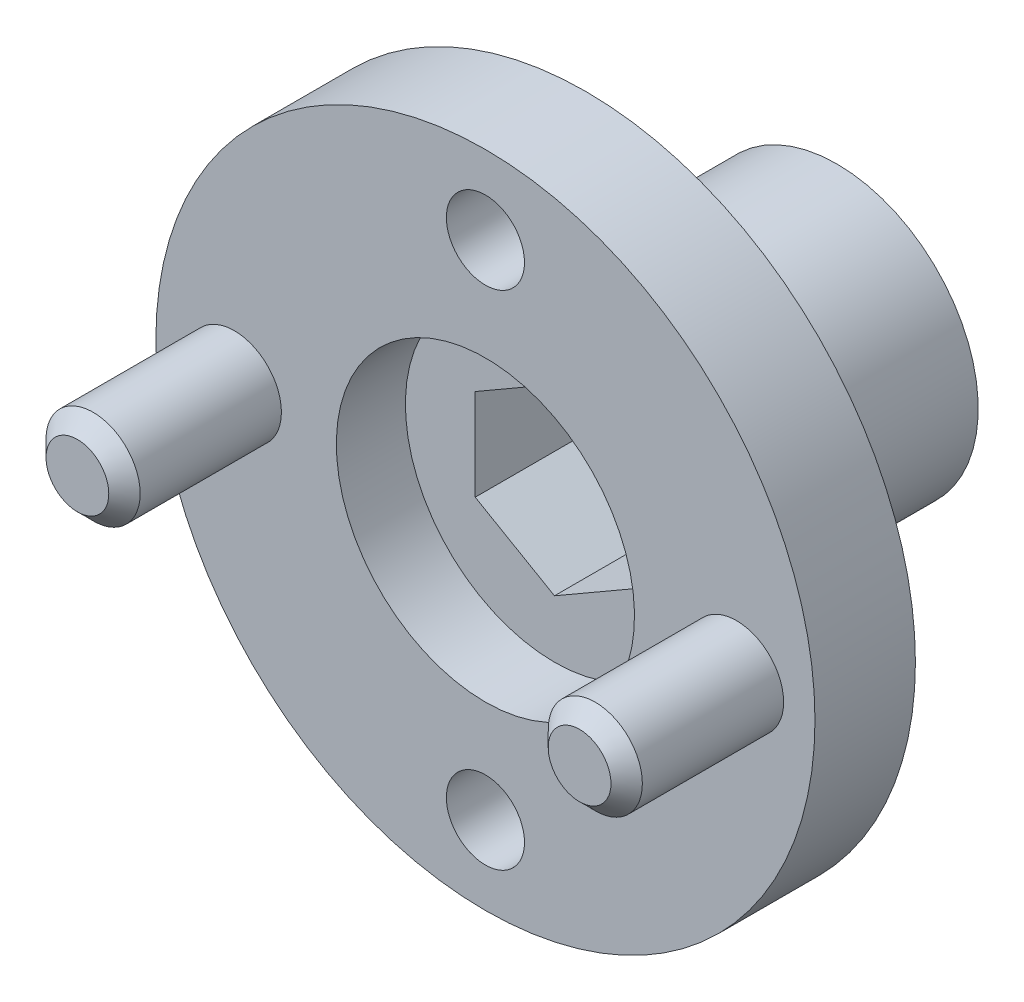
ISO-10303-21;
HEADER;
FILE_DESCRIPTION(('STEP AP214'),'2;1');
FILE_NAME('part.step','',(''),(''),'','','');
FILE_SCHEMA(('AUTOMOTIVE_DESIGN { 1 0 10303 214 1 1 1 1 }'));
ENDSEC;
DATA;
#1=APPLICATION_CONTEXT('core data for automotive mechanical design processes');
#2=APPLICATION_PROTOCOL_DEFINITION('international standard','automotive_design',2000,#1);
#3=PRODUCT_CONTEXT('',#1,'mechanical');
#4=PRODUCT('Part','Part','',(#3));
#5=PRODUCT_RELATED_PRODUCT_CATEGORY('part','',(#4));
#6=PRODUCT_DEFINITION_FORMATION('','',#4);
#7=PRODUCT_DEFINITION_CONTEXT('part definition',#1,'design');
#8=PRODUCT_DEFINITION('design','',#6,#7);
#9=PRODUCT_DEFINITION_SHAPE('','',#8);
#10=(LENGTH_UNIT() NAMED_UNIT(*) SI_UNIT(.MILLI.,.METRE.));
#11=(NAMED_UNIT(*) PLANE_ANGLE_UNIT() SI_UNIT($,.RADIAN.));
#12=(NAMED_UNIT(*) SI_UNIT($,.STERADIAN.) SOLID_ANGLE_UNIT());
#13=UNCERTAINTY_MEASURE_WITH_UNIT(LENGTH_MEASURE(1.E-05),#10,'distance_accuracy_value','');
#14=(GEOMETRIC_REPRESENTATION_CONTEXT(3) GLOBAL_UNCERTAINTY_ASSIGNED_CONTEXT((#13)) GLOBAL_UNIT_ASSIGNED_CONTEXT((#10,
#11,#12)) REPRESENTATION_CONTEXT('',''));
#15=CARTESIAN_POINT('',(0.,0.,0.));
#16=DIRECTION('',(0.,0.,1.));
#17=DIRECTION('',(1.,0.,0.));
#18=AXIS2_PLACEMENT_3D('',#15,#16,#17);
#19=CARTESIAN_POINT('',(0.,0.,0.));
#20=DIRECTION('',(0.,0.,-1.));
#21=DIRECTION('',(0.,1.,0.));
#22=AXIS2_PLACEMENT_3D('',#19,#20,#21);
#23=CYLINDRICAL_SURFACE('',#22,10.5);
#24=CARTESIAN_POINT('',(0.,0.,0.));
#25=DIRECTION('',(0.,0.,-1.));
#26=DIRECTION('',(0.,1.,0.));
#27=AXIS2_PLACEMENT_3D('',#24,#25,#26);
#28=CIRCLE('',#27,10.5);
#29=CARTESIAN_POINT('',(0.,10.5,0.));
#30=VERTEX_POINT('',#29);
#31=EDGE_CURVE('E92',#30,#30,#28,.T.);
#32=ORIENTED_EDGE('',*,*,#31,.T.);
#33=EDGE_LOOP('',(#32));
#34=FACE_BOUND('',#33,.T.);
#35=CARTESIAN_POINT('',(0.,0.,-3.2));
#36=DIRECTION('',(0.,0.,-1.));
#37=DIRECTION('',(0.,1.,0.));
#38=AXIS2_PLACEMENT_3D('',#35,#36,#37);
#39=CIRCLE('',#38,10.5);
#40=CARTESIAN_POINT('',(0.,10.5,-3.2));
#41=VERTEX_POINT('',#40);
#42=EDGE_CURVE('E128',#41,#41,#39,.T.);
#43=ORIENTED_EDGE('',*,*,#42,.F.);
#44=EDGE_LOOP('',(#43));
#45=FACE_BOUND('',#44,.T.);
#46=ADVANCED_FACE('F33',(#34,#45),#23,.T.);
#47=CARTESIAN_POINT('',(10.5,0.,0.));
#48=DIRECTION('',(0.,0.,1.));
#49=DIRECTION('',(0.,-1.,0.));
#50=AXIS2_PLACEMENT_3D('',#47,#48,#49);
#51=PLANE('',#50);
#52=CARTESIAN_POINT('',(0.,-8.,0.));
#53=DIRECTION('',(0.,0.,1.));
#54=DIRECTION('',(1.,0.,0.));
#55=AXIS2_PLACEMENT_3D('',#52,#53,#54);
#56=CIRCLE('',#55,1.24499999999999);
#57=CARTESIAN_POINT('',(1.24499999999999,-8.,0.));
#58=VERTEX_POINT('',#57);
#59=EDGE_CURVE('E145',#58,#58,#56,.T.);
#60=ORIENTED_EDGE('',*,*,#59,.F.);
#61=EDGE_LOOP('',(#60));
#62=FACE_BOUND('',#61,.T.);
#63=CARTESIAN_POINT('',(0.,8.00000000000001,0.));
#64=DIRECTION('',(0.,0.,1.));
#65=DIRECTION('',(1.,0.,0.));
#66=AXIS2_PLACEMENT_3D('',#63,#64,#65);
#67=CIRCLE('',#66,1.24499999999999);
#68=CARTESIAN_POINT('',(1.24499999999999,8.00000000000001,0.));
#69=VERTEX_POINT('',#68);
#70=EDGE_CURVE('E144',#69,#69,#67,.T.);
#71=ORIENTED_EDGE('',*,*,#70,.F.);
#72=EDGE_LOOP('',(#71));
#73=FACE_BOUND('',#72,.T.);
#74=CARTESIAN_POINT('',(8.,0.,0.));
#75=DIRECTION('',(0.,0.,1.));
#76=DIRECTION('',(0.,-1.,0.));
#77=AXIS2_PLACEMENT_3D('',#74,#75,#76);
#78=CIRCLE('',#77,1.5);
#79=CARTESIAN_POINT('',(8.,-1.5,0.));
#80=VERTEX_POINT('',#79);
#81=EDGE_CURVE('E137',#80,#80,#78,.T.);
#82=ORIENTED_EDGE('',*,*,#81,.F.);
#83=EDGE_LOOP('',(#82));
#84=FACE_BOUND('',#83,.T.);
#85=CARTESIAN_POINT('',(-8.,0.,0.));
#86=DIRECTION('',(0.,0.,1.));
#87=DIRECTION('',(0.,-1.,0.));
#88=AXIS2_PLACEMENT_3D('',#85,#86,#87);
#89=CIRCLE('',#88,1.5);
#90=CARTESIAN_POINT('',(-8.,-1.5,0.));
#91=VERTEX_POINT('',#90);
#92=EDGE_CURVE('E91',#91,#91,#89,.T.);
#93=ORIENTED_EDGE('',*,*,#92,.F.);
#94=EDGE_LOOP('',(#93));
#95=FACE_BOUND('',#94,.T.);
#96=CARTESIAN_POINT('',(0.,0.,0.));
#97=DIRECTION('',(0.,0.,1.));
#98=DIRECTION('',(0.,-1.,0.));
#99=AXIS2_PLACEMENT_3D('',#96,#97,#98);
#100=CIRCLE('',#99,4.75);
#101=CARTESIAN_POINT('',(0.,-4.75,0.));
#102=VERTEX_POINT('',#101);
#103=EDGE_CURVE('E254',#102,#102,#100,.T.);
#104=ORIENTED_EDGE('',*,*,#103,.F.);
#105=EDGE_LOOP('',(#104));
#106=FACE_BOUND('',#105,.T.);
#107=ORIENTED_EDGE('',*,*,#31,.F.);
#108=EDGE_LOOP('',(#107));
#109=FACE_BOUND('',#108,.T.);
#110=ADVANCED_FACE('F165',(#62,#73,#84,#95,#106,#109),#51,.T.);
#111=CARTESIAN_POINT('',(0.,0.,-3.2));
#112=DIRECTION('',(0.,0.,-1.));
#113=DIRECTION('',(0.,1.,0.));
#114=AXIS2_PLACEMENT_3D('',#111,#112,#113);
#115=PLANE('',#114);
#116=CARTESIAN_POINT('',(0.,-8.,-3.2));
#117=DIRECTION('',(0.,0.,-1.));
#118=DIRECTION('',(0.,1.,0.));
#119=AXIS2_PLACEMENT_3D('',#116,#117,#118);
#120=CIRCLE('',#119,1.24499999999999);
#121=CARTESIAN_POINT('',(0.,-6.75500000000002,-3.2));
#122=VERTEX_POINT('',#121);
#123=EDGE_CURVE('E141',#122,#122,#120,.T.);
#124=ORIENTED_EDGE('',*,*,#123,.F.);
#125=EDGE_LOOP('',(#124));
#126=FACE_BOUND('',#125,.T.);
#127=CARTESIAN_POINT('',(0.,8.00000000000001,-3.2));
#128=DIRECTION('',(0.,0.,-1.));
#129=DIRECTION('',(0.,1.,0.));
#130=AXIS2_PLACEMENT_3D('',#127,#128,#129);
#131=CIRCLE('',#130,1.24499999999999);
#132=CARTESIAN_POINT('',(0.,9.24499999999999,-3.2));
#133=VERTEX_POINT('',#132);
#134=EDGE_CURVE('E251',#133,#133,#131,.T.);
#135=ORIENTED_EDGE('',*,*,#134,.F.);
#136=EDGE_LOOP('',(#135));
#137=FACE_BOUND('',#136,.T.);
#138=CARTESIAN_POINT('',(0.,0.,-3.2));
#139=DIRECTION('',(0.,0.,-1.));
#140=DIRECTION('',(0.,1.,0.));
#141=AXIS2_PLACEMENT_3D('',#138,#139,#140);
#142=CIRCLE('',#141,6.);
#143=CARTESIAN_POINT('',(0.,6.,-3.2));
#144=VERTEX_POINT('',#143);
#145=EDGE_CURVE('E121',#144,#144,#142,.T.);
#146=ORIENTED_EDGE('',*,*,#145,.F.);
#147=EDGE_LOOP('',(#146));
#148=FACE_BOUND('',#147,.T.);
#149=ORIENTED_EDGE('',*,*,#42,.T.);
#150=EDGE_LOOP('',(#149));
#151=FACE_BOUND('',#150,.T.);
#152=ADVANCED_FACE('F171',(#126,#137,#148,#151),#115,.T.);
#153=CARTESIAN_POINT('',(0.,0.,-4.2));
#154=DIRECTION('',(0.,0.,1.));
#155=DIRECTION('',(0.,-1.,0.));
#156=AXIS2_PLACEMENT_3D('',#153,#154,#155);
#157=CYLINDRICAL_SURFACE('',#156,6.);
#158=CARTESIAN_POINT('',(0.,0.,-4.2));
#159=DIRECTION('',(0.,0.,-1.));
#160=DIRECTION('',(0.,1.,0.));
#161=AXIS2_PLACEMENT_3D('',#158,#159,#160);
#162=CIRCLE('',#161,6.);
#163=CARTESIAN_POINT('',(0.,6.,-4.2));
#164=VERTEX_POINT('',#163);
#165=EDGE_CURVE('E125',#164,#164,#162,.T.);
#166=ORIENTED_EDGE('',*,*,#165,.F.);
#167=EDGE_LOOP('',(#166));
#168=FACE_BOUND('',#167,.T.);
#169=ORIENTED_EDGE('',*,*,#145,.T.);
#170=EDGE_LOOP('',(#169));
#171=FACE_BOUND('',#170,.T.);
#172=ADVANCED_FACE('F178',(#168,#171),#157,.T.);
#173=CARTESIAN_POINT('',(0.,0.,-4.2));
#174=DIRECTION('',(0.,0.,-1.));
#175=DIRECTION('',(0.,1.,0.));
#176=AXIS2_PLACEMENT_3D('',#173,#174,#175);
#177=PLANE('',#176);
#178=CARTESIAN_POINT('',(0.,0.,-4.2));
#179=DIRECTION('',(0.,0.,-1.));
#180=DIRECTION('',(0.,1.,0.));
#181=AXIS2_PLACEMENT_3D('',#178,#179,#180);
#182=CIRCLE('',#181,4.5);
#183=CARTESIAN_POINT('',(0.,4.5,-4.2));
#184=VERTEX_POINT('',#183);
#185=EDGE_CURVE('E122',#184,#184,#182,.T.);
#186=ORIENTED_EDGE('',*,*,#185,.F.);
#187=EDGE_LOOP('',(#186));
#188=FACE_BOUND('',#187,.T.);
#189=ORIENTED_EDGE('',*,*,#165,.T.);
#190=EDGE_LOOP('',(#189));
#191=FACE_BOUND('',#190,.T.);
#192=ADVANCED_FACE('F182',(#188,#191),#177,.T.);
#193=CARTESIAN_POINT('',(0.,0.,-11.2));
#194=DIRECTION('',(0.,0.,1.));
#195=DIRECTION('',(0.,-1.,0.));
#196=AXIS2_PLACEMENT_3D('',#193,#194,#195);
#197=CYLINDRICAL_SURFACE('',#196,4.5);
#198=CARTESIAN_POINT('',(0.,0.,-11.2));
#199=DIRECTION('',(0.,0.,-1.));
#200=DIRECTION('',(0.,1.,0.));
#201=AXIS2_PLACEMENT_3D('',#198,#199,#200);
#202=CIRCLE('',#201,4.5);
#203=CARTESIAN_POINT('',(0.,4.5,-11.2));
#204=VERTEX_POINT('',#203);
#205=EDGE_CURVE('E118',#204,#204,#202,.T.);
#206=ORIENTED_EDGE('',*,*,#205,.F.);
#207=EDGE_LOOP('',(#206));
#208=FACE_BOUND('',#207,.T.);
#209=ORIENTED_EDGE('',*,*,#185,.T.);
#210=EDGE_LOOP('',(#209));
#211=FACE_BOUND('',#210,.T.);
#212=ADVANCED_FACE('F186',(#208,#211),#197,.T.);
#213=CARTESIAN_POINT('',(0.,0.,-11.2));
#214=DIRECTION('',(0.,0.,-1.));
#215=DIRECTION('',(0.,1.,0.));
#216=AXIS2_PLACEMENT_3D('',#213,#214,#215);
#217=PLANE('',#216);
#218=DIRECTION('',(0.866025403784439,0.5,0.));
#219=VECTOR('',#218,1.);
#220=CARTESIAN_POINT('',(0.,-2.91561885940761,-11.2));
#221=LINE('',#220,#219);
#222=CARTESIAN_POINT('',(0.,-2.91561885940761,-11.2));
#223=VERTEX_POINT('',#222);
#224=CARTESIAN_POINT('',(2.525,-1.45780942970381,-11.2));
#225=VERTEX_POINT('',#224);
#226=EDGE_CURVE('E101',#223,#225,#221,.T.);
#227=ORIENTED_EDGE('',*,*,#226,.T.);
#228=DIRECTION('',(0.,1.,0.));
#229=VECTOR('',#228,1.);
#230=CARTESIAN_POINT('',(2.525,-1.45780942970381,-11.2));
#231=LINE('',#230,#229);
#232=CARTESIAN_POINT('',(2.525,1.4578094297038,-11.2));
#233=VERTEX_POINT('',#232);
#234=EDGE_CURVE('E106',#225,#233,#231,.T.);
#235=ORIENTED_EDGE('',*,*,#234,.T.);
#236=DIRECTION('',(-0.866025403784438,0.5,0.));
#237=VECTOR('',#236,1.);
#238=CARTESIAN_POINT('',(2.525,1.4578094297038,-11.2));
#239=LINE('',#238,#237);
#240=CARTESIAN_POINT('',(0.,2.91561885940761,-11.2));
#241=VERTEX_POINT('',#240);
#242=EDGE_CURVE('E56',#233,#241,#239,.T.);
#243=ORIENTED_EDGE('',*,*,#242,.T.);
#244=DIRECTION('',(-0.866025403784439,-0.5,0.));
#245=VECTOR('',#244,1.);
#246=CARTESIAN_POINT('',(0.,2.91561885940761,-11.2));
#247=LINE('',#246,#245);
#248=CARTESIAN_POINT('',(-2.525,1.4578094297038,-11.2));
#249=VERTEX_POINT('',#248);
#250=EDGE_CURVE('E271',#241,#249,#247,.T.);
#251=ORIENTED_EDGE('',*,*,#250,.T.);
#252=DIRECTION('',(0.,-1.,0.));
#253=VECTOR('',#252,1.);
#254=CARTESIAN_POINT('',(-2.525,1.4578094297038,-11.2));
#255=LINE('',#254,#253);
#256=CARTESIAN_POINT('',(-2.525,-1.4578094297038,-11.2));
#257=VERTEX_POINT('',#256);
#258=EDGE_CURVE('E114',#249,#257,#255,.T.);
#259=ORIENTED_EDGE('',*,*,#258,.T.);
#260=DIRECTION('',(0.866025403784439,-0.5,0.));
#261=VECTOR('',#260,1.);
#262=CARTESIAN_POINT('',(-2.525,-1.4578094297038,-11.2));
#263=LINE('',#262,#261);
#264=EDGE_CURVE('E109',#257,#223,#263,.T.);
#265=ORIENTED_EDGE('',*,*,#264,.T.);
#266=EDGE_LOOP('',(#227,#235,#243,#251,#259,#265));
#267=FACE_BOUND('',#266,.T.);
#268=ORIENTED_EDGE('',*,*,#205,.T.);
#269=EDGE_LOOP('',(#268));
#270=FACE_BOUND('',#269,.T.);
#271=ADVANCED_FACE('F190',(#267,#270),#217,.T.);
#272=CARTESIAN_POINT('',(0.,-2.91561885940761,-11.2));
#273=DIRECTION('',(0.5,-0.866025403784439,0.));
#274=DIRECTION('',(0.866025403784439,0.5,0.));
#275=AXIS2_PLACEMENT_3D('',#272,#273,#274);
#276=PLANE('',#275);
#277=DIRECTION('',(0.,0.,1.));
#278=VECTOR('',#277,1.);
#279=CARTESIAN_POINT('',(0.,-2.91561885940761,-11.2));
#280=LINE('',#279,#278);
#281=CARTESIAN_POINT('',(0.,-2.91561885940761,-2.2));
#282=VERTEX_POINT('',#281);
#283=EDGE_CURVE('E100',#223,#282,#280,.T.);
#284=ORIENTED_EDGE('',*,*,#283,.T.);
#285=DIRECTION('',(0.866025403784439,0.5,0.));
#286=VECTOR('',#285,1.);
#287=CARTESIAN_POINT('',(0.,-2.91561885940761,-2.2));
#288=LINE('',#287,#286);
#289=CARTESIAN_POINT('',(2.525,-1.45780942970381,-2.2));
#290=VERTEX_POINT('',#289);
#291=EDGE_CURVE('E87',#282,#290,#288,.T.);
#292=ORIENTED_EDGE('',*,*,#291,.T.);
#293=DIRECTION('',(0.,0.,1.));
#294=VECTOR('',#293,1.);
#295=CARTESIAN_POINT('',(2.525,-1.45780942970381,-11.2));
#296=LINE('',#295,#294);
#297=EDGE_CURVE('E98',#225,#290,#296,.T.);
#298=ORIENTED_EDGE('',*,*,#297,.F.);
#299=ORIENTED_EDGE('',*,*,#226,.F.);
#300=EDGE_LOOP('',(#284,#292,#298,#299));
#301=FACE_BOUND('',#300,.T.);
#302=ADVANCED_FACE('F96',(#301),#276,.F.);
#303=CARTESIAN_POINT('',(-2.525,-1.4578094297038,-11.2));
#304=DIRECTION('',(-0.5,-0.866025403784439,0.));
#305=DIRECTION('',(0.866025403784439,-0.5,0.));
#306=AXIS2_PLACEMENT_3D('',#303,#304,#305);
#307=PLANE('',#306);
#308=DIRECTION('',(0.,0.,1.));
#309=VECTOR('',#308,1.);
#310=CARTESIAN_POINT('',(-2.525,-1.4578094297038,-11.2));
#311=LINE('',#310,#309);
#312=CARTESIAN_POINT('',(-2.525,-1.4578094297038,-2.2));
#313=VERTEX_POINT('',#312);
#314=EDGE_CURVE('E277',#257,#313,#311,.T.);
#315=ORIENTED_EDGE('',*,*,#314,.T.);
#316=DIRECTION('',(0.866025403784439,-0.5,0.));
#317=VECTOR('',#316,1.);
#318=CARTESIAN_POINT('',(-2.525,-1.4578094297038,-2.2));
#319=LINE('',#318,#317);
#320=EDGE_CURVE('E102',#313,#282,#319,.T.);
#321=ORIENTED_EDGE('',*,*,#320,.T.);
#322=ORIENTED_EDGE('',*,*,#283,.F.);
#323=ORIENTED_EDGE('',*,*,#264,.F.);
#324=EDGE_LOOP('',(#315,#321,#322,#323));
#325=FACE_BOUND('',#324,.T.);
#326=ADVANCED_FACE('F197',(#325),#307,.F.);
#327=CARTESIAN_POINT('',(-2.525,1.4578094297038,-11.2));
#328=DIRECTION('',(-1.,0.,0.));
#329=DIRECTION('',(0.,-1.,0.));
#330=AXIS2_PLACEMENT_3D('',#327,#328,#329);
#331=PLANE('',#330);
#332=DIRECTION('',(0.,0.,1.));
#333=VECTOR('',#332,1.);
#334=CARTESIAN_POINT('',(-2.525,1.4578094297038,-11.2));
#335=LINE('',#334,#333);
#336=CARTESIAN_POINT('',(-2.525,1.4578094297038,-2.2));
#337=VERTEX_POINT('',#336);
#338=EDGE_CURVE('E280',#249,#337,#335,.T.);
#339=ORIENTED_EDGE('',*,*,#338,.T.);
#340=DIRECTION('',(0.,-1.,0.));
#341=VECTOR('',#340,1.);
#342=CARTESIAN_POINT('',(-2.525,1.4578094297038,-2.2));
#343=LINE('',#342,#341);
#344=EDGE_CURVE('E264',#337,#313,#343,.T.);
#345=ORIENTED_EDGE('',*,*,#344,.T.);
#346=ORIENTED_EDGE('',*,*,#314,.F.);
#347=ORIENTED_EDGE('',*,*,#258,.F.);
#348=EDGE_LOOP('',(#339,#345,#346,#347));
#349=FACE_BOUND('',#348,.T.);
#350=ADVANCED_FACE('F206',(#349),#331,.F.);
#351=CARTESIAN_POINT('',(0.,2.91561885940761,-11.2));
#352=DIRECTION('',(-0.5,0.866025403784439,0.));
#353=DIRECTION('',(-0.866025403784439,-0.5,0.));
#354=AXIS2_PLACEMENT_3D('',#351,#352,#353);
#355=PLANE('',#354);
#356=DIRECTION('',(0.,0.,1.));
#357=VECTOR('',#356,1.);
#358=CARTESIAN_POINT('',(0.,2.91561885940761,-11.2));
#359=LINE('',#358,#357);
#360=CARTESIAN_POINT('',(0.,2.91561885940761,-2.2));
#361=VERTEX_POINT('',#360);
#362=EDGE_CURVE('E111',#241,#361,#359,.T.);
#363=ORIENTED_EDGE('',*,*,#362,.T.);
#364=DIRECTION('',(-0.866025403784439,-0.5,0.));
#365=VECTOR('',#364,1.);
#366=CARTESIAN_POINT('',(0.,2.91561885940761,-2.2));
#367=LINE('',#366,#365);
#368=EDGE_CURVE('E261',#361,#337,#367,.T.);
#369=ORIENTED_EDGE('',*,*,#368,.T.);
#370=ORIENTED_EDGE('',*,*,#338,.F.);
#371=ORIENTED_EDGE('',*,*,#250,.F.);
#372=EDGE_LOOP('',(#363,#369,#370,#371));
#373=FACE_BOUND('',#372,.T.);
#374=ADVANCED_FACE('F203',(#373),#355,.F.);
#375=CARTESIAN_POINT('',(2.525,1.4578094297038,-11.2));
#376=DIRECTION('',(0.5,0.866025403784438,0.));
#377=DIRECTION('',(-0.866025403784438,0.5,0.));
#378=AXIS2_PLACEMENT_3D('',#375,#376,#377);
#379=PLANE('',#378);
#380=DIRECTION('',(0.,0.,1.));
#381=VECTOR('',#380,1.);
#382=CARTESIAN_POINT('',(2.525,1.4578094297038,-11.2));
#383=LINE('',#382,#381);
#384=CARTESIAN_POINT('',(2.525,1.4578094297038,-2.2));
#385=VERTEX_POINT('',#384);
#386=EDGE_CURVE('E108',#233,#385,#383,.T.);
#387=ORIENTED_EDGE('',*,*,#386,.T.);
#388=DIRECTION('',(-0.866025403784438,0.5,0.));
#389=VECTOR('',#388,1.);
#390=CARTESIAN_POINT('',(2.525,1.4578094297038,-2.2));
#391=LINE('',#390,#389);
#392=EDGE_CURVE('E48',#385,#361,#391,.T.);
#393=ORIENTED_EDGE('',*,*,#392,.T.);
#394=ORIENTED_EDGE('',*,*,#362,.F.);
#395=ORIENTED_EDGE('',*,*,#242,.F.);
#396=EDGE_LOOP('',(#387,#393,#394,#395));
#397=FACE_BOUND('',#396,.T.);
#398=ADVANCED_FACE('F200',(#397),#379,.F.);
#399=CARTESIAN_POINT('',(2.525,-1.45780942970381,-11.2));
#400=DIRECTION('',(1.,0.,0.));
#401=DIRECTION('',(0.,1.,0.));
#402=AXIS2_PLACEMENT_3D('',#399,#400,#401);
#403=PLANE('',#402);
#404=ORIENTED_EDGE('',*,*,#297,.T.);
#405=DIRECTION('',(0.,1.,0.));
#406=VECTOR('',#405,1.);
#407=CARTESIAN_POINT('',(2.525,-1.45780942970381,-2.2));
#408=LINE('',#407,#406);
#409=EDGE_CURVE('E84',#290,#385,#408,.T.);
#410=ORIENTED_EDGE('',*,*,#409,.T.);
#411=ORIENTED_EDGE('',*,*,#386,.F.);
#412=ORIENTED_EDGE('',*,*,#234,.F.);
#413=EDGE_LOOP('',(#404,#410,#411,#412));
#414=FACE_BOUND('',#413,.T.);
#415=ADVANCED_FACE('F104',(#414),#403,.F.);
#416=CARTESIAN_POINT('',(0.,-4.75,-2.2));
#417=DIRECTION('',(0.,0.,-1.));
#418=DIRECTION('',(0.,1.,0.));
#419=AXIS2_PLACEMENT_3D('',#416,#417,#418);
#420=PLANE('',#419);
#421=CARTESIAN_POINT('',(0.,0.,-2.2));
#422=DIRECTION('',(0.,0.,1.));
#423=DIRECTION('',(0.,-1.,0.));
#424=AXIS2_PLACEMENT_3D('',#421,#422,#423);
#425=CIRCLE('',#424,4.75);
#426=CARTESIAN_POINT('',(0.,-4.75,-2.2));
#427=VERTEX_POINT('',#426);
#428=EDGE_CURVE('E257',#427,#427,#425,.T.);
#429=ORIENTED_EDGE('',*,*,#428,.T.);
#430=EDGE_LOOP('',(#429));
#431=FACE_BOUND('',#430,.T.);
#432=ORIENTED_EDGE('',*,*,#320,.F.);
#433=ORIENTED_EDGE('',*,*,#344,.F.);
#434=ORIENTED_EDGE('',*,*,#368,.F.);
#435=ORIENTED_EDGE('',*,*,#392,.F.);
#436=ORIENTED_EDGE('',*,*,#409,.F.);
#437=ORIENTED_EDGE('',*,*,#291,.F.);
#438=EDGE_LOOP('',(#432,#433,#434,#435,#436,#437));
#439=FACE_BOUND('',#438,.T.);
#440=ADVANCED_FACE('F86',(#431,#439),#420,.F.);
#441=CARTESIAN_POINT('',(0.,0.,-2.2));
#442=DIRECTION('',(0.,0.,1.));
#443=DIRECTION('',(0.,-1.,0.));
#444=AXIS2_PLACEMENT_3D('',#441,#442,#443);
#445=CYLINDRICAL_SURFACE('',#444,4.75);
#446=ORIENTED_EDGE('',*,*,#428,.F.);
#447=EDGE_LOOP('',(#446));
#448=FACE_BOUND('',#447,.T.);
#449=ORIENTED_EDGE('',*,*,#103,.T.);
#450=EDGE_LOOP('',(#449));
#451=FACE_BOUND('',#450,.T.);
#452=ADVANCED_FACE('F214',(#448,#451),#445,.F.);
#453=CARTESIAN_POINT('',(-8.,0.,0.));
#454=DIRECTION('',(0.,0.,1.));
#455=DIRECTION('',(1.,0.,0.));
#456=AXIS2_PLACEMENT_3D('',#453,#454,#455);
#457=CYLINDRICAL_SURFACE('',#456,1.5);
#458=CARTESIAN_POINT('',(-8.,0.,4.49999999991451));
#459=DIRECTION('',(0.,0.,1.));
#460=DIRECTION('',(1.,0.,0.));
#461=AXIS2_PLACEMENT_3D('',#458,#459,#460);
#462=CIRCLE('',#461,1.5);
#463=CARTESIAN_POINT('',(-6.5,0.,4.49999999991451));
#464=VERTEX_POINT('',#463);
#465=EDGE_CURVE('E148',#464,#464,#462,.F.);
#466=ORIENTED_EDGE('',*,*,#465,.T.);
#467=EDGE_LOOP('',(#466));
#468=FACE_BOUND('',#467,.T.);
#469=ORIENTED_EDGE('',*,*,#92,.T.);
#470=EDGE_LOOP('',(#469));
#471=FACE_BOUND('',#470,.T.);
#472=ADVANCED_FACE('F217',(#468,#471),#457,.T.);
#473=CARTESIAN_POINT('',(-8.,0.,5.));
#474=DIRECTION('',(0.,0.,1.));
#475=DIRECTION('',(1.,0.,0.));
#476=AXIS2_PLACEMENT_3D('',#473,#474,#475);
#477=PLANE('',#476);
#478=CARTESIAN_POINT('',(-8.,0.,5.));
#479=DIRECTION('',(0.,0.,1.));
#480=DIRECTION('',(1.,0.,0.));
#481=AXIS2_PLACEMENT_3D('',#478,#479,#480);
#482=CIRCLE('',#481,0.999999999971357);
#483=CARTESIAN_POINT('',(-7.00000000002864,0.,5.));
#484=VERTEX_POINT('',#483);
#485=EDGE_CURVE('E140',#484,#484,#482,.T.);
#486=ORIENTED_EDGE('',*,*,#485,.T.);
#487=EDGE_LOOP('',(#486));
#488=FACE_BOUND('',#487,.T.);
#489=ADVANCED_FACE('F224',(#488),#477,.T.);
#490=CARTESIAN_POINT('',(8.,0.,0.));
#491=DIRECTION('',(0.,0.,1.));
#492=DIRECTION('',(1.,0.,0.));
#493=AXIS2_PLACEMENT_3D('',#490,#491,#492);
#494=CYLINDRICAL_SURFACE('',#493,1.5);
#495=CARTESIAN_POINT('',(8.,0.,4.49999999991451));
#496=DIRECTION('',(0.,0.,1.));
#497=DIRECTION('',(1.,0.,0.));
#498=AXIS2_PLACEMENT_3D('',#495,#496,#497);
#499=CIRCLE('',#498,1.5);
#500=CARTESIAN_POINT('',(9.5,0.,4.49999999991451));
#501=VERTEX_POINT('',#500);
#502=EDGE_CURVE('E11',#501,#501,#499,.F.);
#503=ORIENTED_EDGE('',*,*,#502,.T.);
#504=EDGE_LOOP('',(#503));
#505=FACE_BOUND('',#504,.T.);
#506=ORIENTED_EDGE('',*,*,#81,.T.);
#507=EDGE_LOOP('',(#506));
#508=FACE_BOUND('',#507,.T.);
#509=ADVANCED_FACE('F228',(#505,#508),#494,.T.);
#510=CARTESIAN_POINT('',(8.,0.,5.));
#511=DIRECTION('',(0.,0.,1.));
#512=DIRECTION('',(1.,0.,0.));
#513=AXIS2_PLACEMENT_3D('',#510,#511,#512);
#514=PLANE('',#513);
#515=CARTESIAN_POINT('',(8.,0.,5.));
#516=DIRECTION('',(0.,0.,1.));
#517=DIRECTION('',(1.,0.,0.));
#518=AXIS2_PLACEMENT_3D('',#515,#516,#517);
#519=CIRCLE('',#518,0.999999999971357);
#520=CARTESIAN_POINT('',(8.99999999997136,0.,5.));
#521=VERTEX_POINT('',#520);
#522=EDGE_CURVE('E41',#521,#521,#519,.T.);
#523=ORIENTED_EDGE('',*,*,#522,.T.);
#524=EDGE_LOOP('',(#523));
#525=FACE_BOUND('',#524,.T.);
#526=ADVANCED_FACE('F153',(#525),#514,.T.);
#527=CARTESIAN_POINT('',(0.,8.00000000000001,0.));
#528=DIRECTION('',(0.,0.,1.));
#529=DIRECTION('',(1.,0.,0.));
#530=AXIS2_PLACEMENT_3D('',#527,#528,#529);
#531=CYLINDRICAL_SURFACE('',#530,1.24499999999999);
#532=ORIENTED_EDGE('',*,*,#134,.T.);
#533=EDGE_LOOP('',(#532));
#534=FACE_BOUND('',#533,.T.);
#535=ORIENTED_EDGE('',*,*,#70,.T.);
#536=EDGE_LOOP('',(#535));
#537=FACE_BOUND('',#536,.T.);
#538=ADVANCED_FACE('F235',(#534,#537),#531,.F.);
#539=CARTESIAN_POINT('',(0.,-8.,0.));
#540=DIRECTION('',(0.,0.,1.));
#541=DIRECTION('',(1.,0.,0.));
#542=AXIS2_PLACEMENT_3D('',#539,#540,#541);
#543=CYLINDRICAL_SURFACE('',#542,1.24499999999999);
#544=ORIENTED_EDGE('',*,*,#123,.T.);
#545=EDGE_LOOP('',(#544));
#546=FACE_BOUND('',#545,.T.);
#547=ORIENTED_EDGE('',*,*,#59,.T.);
#548=EDGE_LOOP('',(#547));
#549=FACE_BOUND('',#548,.T.);
#550=ADVANCED_FACE('F161',(#546,#549),#543,.F.);
#551=CARTESIAN_POINT('',(-8.,0.,5.));
#552=DIRECTION('',(0.,0.,-1.));
#553=DIRECTION('',(-1.,0.,0.));
#554=AXIS2_PLACEMENT_3D('',#551,#552,#553);
#555=CONICAL_SURFACE('',#554,0.999999999971357,0.785398163340601);
#556=ORIENTED_EDGE('',*,*,#465,.F.);
#557=EDGE_LOOP('',(#556));
#558=FACE_BOUND('',#557,.T.);
#559=ORIENTED_EDGE('',*,*,#485,.F.);
#560=EDGE_LOOP('',(#559));
#561=FACE_BOUND('',#560,.T.);
#562=ADVANCED_FACE('F156',(#558,#561),#555,.T.);
#563=CARTESIAN_POINT('',(8.,0.,5.));
#564=DIRECTION('',(0.,0.,-1.));
#565=DIRECTION('',(-1.,0.,0.));
#566=AXIS2_PLACEMENT_3D('',#563,#564,#565);
#567=CONICAL_SURFACE('',#566,0.999999999971357,0.785398163340601);
#568=ORIENTED_EDGE('',*,*,#502,.F.);
#569=EDGE_LOOP('',(#568));
#570=FACE_BOUND('',#569,.T.);
#571=ORIENTED_EDGE('',*,*,#522,.F.);
#572=EDGE_LOOP('',(#571));
#573=FACE_BOUND('',#572,.T.);
#574=ADVANCED_FACE('F35',(#570,#573),#567,.T.);
#575=CLOSED_SHELL('',(#46,#110,#152,#172,#192,#212,#271,#302,#326,#350,#374,#398,#415,#440,#452,
#472,#489,#509,#526,#538,#550,#562,#574));
#576=MANIFOLD_SOLID_BREP('B2',#575);
#577=ADVANCED_BREP_SHAPE_REPRESENTATION('',(#18,#576),#14);
#578=SHAPE_DEFINITION_REPRESENTATION(#9,#577);
ENDSEC;
END-ISO-10303-21;
